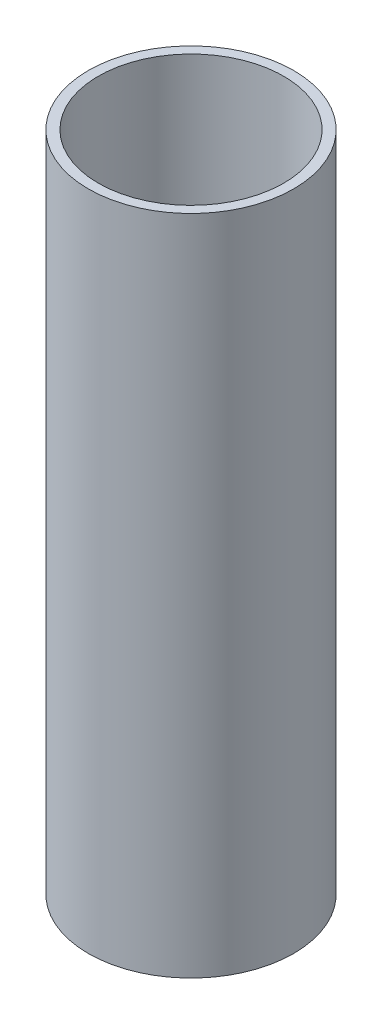
ISO-10303-21;
HEADER;
FILE_DESCRIPTION(('STEP AP214'),'2;1');
FILE_NAME('part.step','',(''),(''),'','','');
FILE_SCHEMA(('AUTOMOTIVE_DESIGN { 1 0 10303 214 1 1 1 1 }'));
ENDSEC;
DATA;
#1=APPLICATION_CONTEXT('core data for automotive mechanical design processes');
#2=APPLICATION_PROTOCOL_DEFINITION('international standard','automotive_design',2000,#1);
#3=PRODUCT_CONTEXT('',#1,'mechanical');
#4=PRODUCT('Part','Part','',(#3));
#5=PRODUCT_RELATED_PRODUCT_CATEGORY('part','',(#4));
#6=PRODUCT_DEFINITION_FORMATION('','',#4);
#7=PRODUCT_DEFINITION_CONTEXT('part definition',#1,'design');
#8=PRODUCT_DEFINITION('design','',#6,#7);
#9=PRODUCT_DEFINITION_SHAPE('','',#8);
#10=(LENGTH_UNIT() NAMED_UNIT(*) SI_UNIT(.MILLI.,.METRE.));
#11=(NAMED_UNIT(*) PLANE_ANGLE_UNIT() SI_UNIT($,.RADIAN.));
#12=(NAMED_UNIT(*) SI_UNIT($,.STERADIAN.) SOLID_ANGLE_UNIT());
#13=UNCERTAINTY_MEASURE_WITH_UNIT(LENGTH_MEASURE(1.E-05),#10,'distance_accuracy_value','');
#14=(GEOMETRIC_REPRESENTATION_CONTEXT(3) GLOBAL_UNCERTAINTY_ASSIGNED_CONTEXT((#13)) GLOBAL_UNIT_ASSIGNED_CONTEXT((#10,
#11,#12)) REPRESENTATION_CONTEXT('',''));
#15=CARTESIAN_POINT('',(0.,0.,0.));
#16=DIRECTION('',(0.,0.,1.));
#17=DIRECTION('',(1.,0.,0.));
#18=AXIS2_PLACEMENT_3D('',#15,#16,#17);
#19=CARTESIAN_POINT('',(0.,50.,0.));
#20=DIRECTION('',(0.,1.,0.));
#21=DIRECTION('',(0.,0.,1.));
#22=AXIS2_PLACEMENT_3D('',#19,#20,#21);
#23=PLANE('',#22);
#24=CARTESIAN_POINT('',(0.,50.,0.));
#25=DIRECTION('',(0.,1.,0.));
#26=DIRECTION('',(0.,0.,1.));
#27=AXIS2_PLACEMENT_3D('',#24,#25,#26);
#28=CIRCLE('',#27,15.5);
#29=CARTESIAN_POINT('',(0.,50.,15.5));
#30=VERTEX_POINT('',#29);
#31=EDGE_CURVE('E10',#30,#30,#28,.T.);
#32=ORIENTED_EDGE('',*,*,#31,.T.);
#33=EDGE_LOOP('',(#32));
#34=FACE_BOUND('',#33,.T.);
#35=CARTESIAN_POINT('',(0.,50.,0.));
#36=DIRECTION('',(0.,1.,0.));
#37=DIRECTION('',(0.,0.,1.));
#38=AXIS2_PLACEMENT_3D('',#35,#36,#37);
#39=CIRCLE('',#38,14.);
#40=CARTESIAN_POINT('',(0.,50.,14.));
#41=VERTEX_POINT('',#40);
#42=EDGE_CURVE('E50',#41,#41,#39,.T.);
#43=ORIENTED_EDGE('',*,*,#42,.F.);
#44=EDGE_LOOP('',(#43));
#45=FACE_BOUND('',#44,.T.);
#46=ADVANCED_FACE('F37',(#34,#45),#23,.T.);
#47=CARTESIAN_POINT('',(0.,-50.,0.));
#48=DIRECTION('',(0.,1.,0.));
#49=DIRECTION('',(0.,0.,1.));
#50=AXIS2_PLACEMENT_3D('',#47,#48,#49);
#51=PLANE('',#50);
#52=CARTESIAN_POINT('',(0.,-50.,0.));
#53=DIRECTION('',(0.,1.,0.));
#54=DIRECTION('',(0.,0.,1.));
#55=AXIS2_PLACEMENT_3D('',#52,#53,#54);
#56=CIRCLE('',#55,15.5);
#57=CARTESIAN_POINT('',(0.,-50.,15.5));
#58=VERTEX_POINT('',#57);
#59=EDGE_CURVE('E41',#58,#58,#56,.T.);
#60=ORIENTED_EDGE('',*,*,#59,.F.);
#61=EDGE_LOOP('',(#60));
#62=FACE_BOUND('',#61,.T.);
#63=CARTESIAN_POINT('',(0.,-50.,0.));
#64=DIRECTION('',(0.,1.,0.));
#65=DIRECTION('',(0.,0.,1.));
#66=AXIS2_PLACEMENT_3D('',#63,#64,#65);
#67=CIRCLE('',#66,14.);
#68=CARTESIAN_POINT('',(0.,-50.,14.));
#69=VERTEX_POINT('',#68);
#70=EDGE_CURVE('E52',#69,#69,#67,.T.);
#71=ORIENTED_EDGE('',*,*,#70,.T.);
#72=EDGE_LOOP('',(#71));
#73=FACE_BOUND('',#72,.T.);
#74=ADVANCED_FACE('F64',(#62,#73),#51,.F.);
#75=CARTESIAN_POINT('',(0.,50.,0.));
#76=DIRECTION('',(0.,-1.,0.));
#77=DIRECTION('',(0.,0.,-1.));
#78=AXIS2_PLACEMENT_3D('',#75,#76,#77);
#79=CYLINDRICAL_SURFACE('',#78,15.5);
#80=ORIENTED_EDGE('',*,*,#31,.F.);
#81=EDGE_LOOP('',(#80));
#82=FACE_BOUND('',#81,.T.);
#83=ORIENTED_EDGE('',*,*,#59,.T.);
#84=EDGE_LOOP('',(#83));
#85=FACE_BOUND('',#84,.T.);
#86=ADVANCED_FACE('F39',(#82,#85),#79,.T.);
#87=CARTESIAN_POINT('',(0.,50.,0.));
#88=DIRECTION('',(0.,-1.,0.));
#89=DIRECTION('',(0.,0.,-1.));
#90=AXIS2_PLACEMENT_3D('',#87,#88,#89);
#91=CYLINDRICAL_SURFACE('',#90,14.);
#92=ORIENTED_EDGE('',*,*,#42,.T.);
#93=EDGE_LOOP('',(#92));
#94=FACE_BOUND('',#93,.T.);
#95=ORIENTED_EDGE('',*,*,#70,.F.);
#96=EDGE_LOOP('',(#95));
#97=FACE_BOUND('',#96,.T.);
#98=ADVANCED_FACE('F60',(#94,#97),#91,.F.);
#99=CLOSED_SHELL('',(#46,#74,#86,#98));
#100=MANIFOLD_SOLID_BREP('B2',#99);
#101=ADVANCED_BREP_SHAPE_REPRESENTATION('',(#18,#100),#14);
#102=SHAPE_DEFINITION_REPRESENTATION(#9,#101);
ENDSEC;
END-ISO-10303-21;
